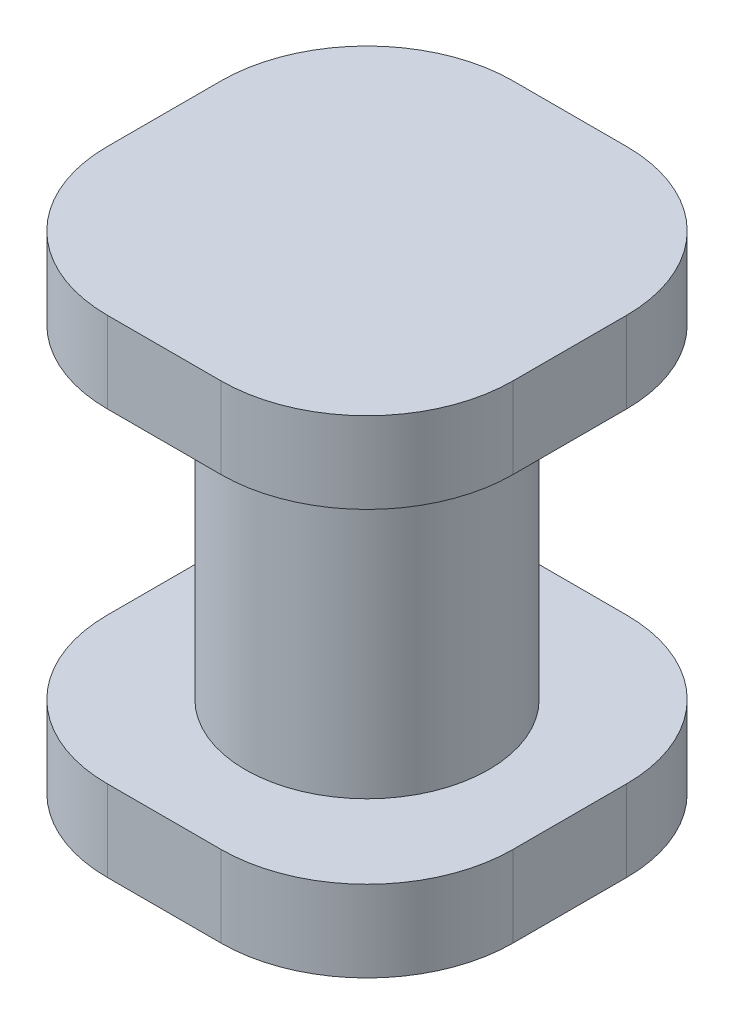
ISO-10303-21;
HEADER;
FILE_DESCRIPTION(('STEP AP214'),'2;1');
FILE_NAME('part.step','',(''),(''),'','','');
FILE_SCHEMA(('AUTOMOTIVE_DESIGN { 1 0 10303 214 1 1 1 1 }'));
ENDSEC;
DATA;
#1=APPLICATION_CONTEXT('core data for automotive mechanical design processes');
#2=APPLICATION_PROTOCOL_DEFINITION('international standard','automotive_design',2000,#1);
#3=PRODUCT_CONTEXT('',#1,'mechanical');
#4=PRODUCT('Part','Part','',(#3));
#5=PRODUCT_RELATED_PRODUCT_CATEGORY('part','',(#4));
#6=PRODUCT_DEFINITION_FORMATION('','',#4);
#7=PRODUCT_DEFINITION_CONTEXT('part definition',#1,'design');
#8=PRODUCT_DEFINITION('design','',#6,#7);
#9=PRODUCT_DEFINITION_SHAPE('','',#8);
#10=(LENGTH_UNIT() NAMED_UNIT(*) SI_UNIT(.MILLI.,.METRE.));
#11=(NAMED_UNIT(*) PLANE_ANGLE_UNIT() SI_UNIT($,.RADIAN.));
#12=(NAMED_UNIT(*) SI_UNIT($,.STERADIAN.) SOLID_ANGLE_UNIT());
#13=UNCERTAINTY_MEASURE_WITH_UNIT(LENGTH_MEASURE(1.E-05),#10,'distance_accuracy_value','');
#14=(GEOMETRIC_REPRESENTATION_CONTEXT(3) GLOBAL_UNCERTAINTY_ASSIGNED_CONTEXT((#13)) GLOBAL_UNIT_ASSIGNED_CONTEXT((#10,
#11,#12)) REPRESENTATION_CONTEXT('',''));
#15=CARTESIAN_POINT('',(0.,0.,0.));
#16=DIRECTION('',(0.,0.,1.));
#17=DIRECTION('',(1.,0.,0.));
#18=AXIS2_PLACEMENT_3D('',#15,#16,#17);
#19=CARTESIAN_POINT('',(0.,15.,0.));
#20=DIRECTION('',(0.,-1.,0.));
#21=DIRECTION('',(0.,0.,-1.));
#22=AXIS2_PLACEMENT_3D('',#19,#20,#21);
#23=CYLINDRICAL_SURFACE('',#22,3.75);
#24=CARTESIAN_POINT('',(0.,15.,0.));
#25=DIRECTION('',(0.,1.,0.));
#26=DIRECTION('',(0.,0.,1.));
#27=AXIS2_PLACEMENT_3D('',#24,#25,#26);
#28=CIRCLE('',#27,3.75);
#29=CARTESIAN_POINT('',(0.,15.,3.75));
#30=VERTEX_POINT('',#29);
#31=EDGE_CURVE('E11',#30,#30,#28,.T.);
#32=ORIENTED_EDGE('',*,*,#31,.F.);
#33=EDGE_LOOP('',(#32));
#34=FACE_BOUND('',#33,.T.);
#35=CARTESIAN_POINT('',(0.,5.,0.));
#36=DIRECTION('',(0.,1.,0.));
#37=DIRECTION('',(0.,0.,1.));
#38=AXIS2_PLACEMENT_3D('',#35,#36,#37);
#39=CIRCLE('',#38,3.75);
#40=CARTESIAN_POINT('',(0.,5.,3.75));
#41=VERTEX_POINT('',#40);
#42=EDGE_CURVE('E45',#41,#41,#39,.T.);
#43=ORIENTED_EDGE('',*,*,#42,.T.);
#44=EDGE_LOOP('',(#43));
#45=FACE_BOUND('',#44,.T.);
#46=ADVANCED_FACE('F42',(#34,#45),#23,.T.);
#47=CARTESIAN_POINT('',(-1.75,17.5,1.75));
#48=DIRECTION('',(0.,-1.,0.));
#49=DIRECTION('',(0.,0.,-1.));
#50=AXIS2_PLACEMENT_3D('',#47,#48,#49);
#51=CYLINDRICAL_SURFACE('',#50,4.5);
#52=CARTESIAN_POINT('',(-1.75,15.,1.75));
#53=DIRECTION('',(0.,1.,0.));
#54=DIRECTION('',(0.,0.,1.));
#55=AXIS2_PLACEMENT_3D('',#52,#53,#54);
#56=CIRCLE('',#55,4.5);
#57=CARTESIAN_POINT('',(-6.25,15.,1.74999999999997));
#58=VERTEX_POINT('',#57);
#59=CARTESIAN_POINT('',(-1.74999999999997,15.,6.25));
#60=VERTEX_POINT('',#59);
#61=EDGE_CURVE('E144',#58,#60,#56,.T.);
#62=ORIENTED_EDGE('',*,*,#61,.T.);
#63=DIRECTION('',(0.,-1.,0.));
#64=VECTOR('',#63,1.);
#65=CARTESIAN_POINT('',(-1.74999999999997,17.5,6.25));
#66=LINE('',#65,#64);
#67=CARTESIAN_POINT('',(-1.74999999999997,17.5,6.25));
#68=VERTEX_POINT('',#67);
#69=EDGE_CURVE('E51',#68,#60,#66,.T.);
#70=ORIENTED_EDGE('',*,*,#69,.F.);
#71=CARTESIAN_POINT('',(-1.75,17.5,1.75));
#72=DIRECTION('',(0.,1.,0.));
#73=DIRECTION('',(0.,0.,1.));
#74=AXIS2_PLACEMENT_3D('',#71,#72,#73);
#75=CIRCLE('',#74,4.5);
#76=CARTESIAN_POINT('',(-6.25,17.5,1.74999999999997));
#77=VERTEX_POINT('',#76);
#78=EDGE_CURVE('E158',#77,#68,#75,.T.);
#79=ORIENTED_EDGE('',*,*,#78,.F.);
#80=DIRECTION('',(0.,-1.,0.));
#81=VECTOR('',#80,1.);
#82=CARTESIAN_POINT('',(-6.25,17.5,1.74999999999997));
#83=LINE('',#82,#81);
#84=EDGE_CURVE('E140',#77,#58,#83,.T.);
#85=ORIENTED_EDGE('',*,*,#84,.T.);
#86=EDGE_LOOP('',(#62,#70,#79,#85));
#87=FACE_BOUND('',#86,.T.);
#88=ADVANCED_FACE('F176',(#87),#51,.T.);
#89=CARTESIAN_POINT('',(-1.74999999999997,17.5,6.25));
#90=DIRECTION('',(0.,0.,-1.));
#91=DIRECTION('',(-1.,0.,0.));
#92=AXIS2_PLACEMENT_3D('',#89,#90,#91);
#93=PLANE('',#92);
#94=DIRECTION('',(1.,0.,0.));
#95=VECTOR('',#94,1.);
#96=CARTESIAN_POINT('',(-1.74999999999997,15.,6.25));
#97=LINE('',#96,#95);
#98=CARTESIAN_POINT('',(1.74999999999997,15.,6.25));
#99=VERTEX_POINT('',#98);
#100=EDGE_CURVE('E147',#60,#99,#97,.T.);
#101=ORIENTED_EDGE('',*,*,#100,.T.);
#102=DIRECTION('',(0.,-1.,0.));
#103=VECTOR('',#102,1.);
#104=CARTESIAN_POINT('',(1.74999999999997,17.5,6.25));
#105=LINE('',#104,#103);
#106=CARTESIAN_POINT('',(1.74999999999997,17.5,6.25));
#107=VERTEX_POINT('',#106);
#108=EDGE_CURVE('E168',#107,#99,#105,.T.);
#109=ORIENTED_EDGE('',*,*,#108,.F.);
#110=DIRECTION('',(1.,0.,0.));
#111=VECTOR('',#110,1.);
#112=CARTESIAN_POINT('',(-1.74999999999997,17.5,6.25));
#113=LINE('',#112,#111);
#114=EDGE_CURVE('E104',#68,#107,#113,.T.);
#115=ORIENTED_EDGE('',*,*,#114,.F.);
#116=ORIENTED_EDGE('',*,*,#69,.T.);
#117=EDGE_LOOP('',(#101,#109,#115,#116));
#118=FACE_BOUND('',#117,.T.);
#119=ADVANCED_FACE('F172',(#118),#93,.F.);
#120=CARTESIAN_POINT('',(1.75,17.5,1.75));
#121=DIRECTION('',(0.,-1.,0.));
#122=DIRECTION('',(0.,0.,-1.));
#123=AXIS2_PLACEMENT_3D('',#120,#121,#122);
#124=CYLINDRICAL_SURFACE('',#123,4.5);
#125=CARTESIAN_POINT('',(1.75,15.,1.75));
#126=DIRECTION('',(0.,1.,0.));
#127=DIRECTION('',(0.,0.,1.));
#128=AXIS2_PLACEMENT_3D('',#125,#126,#127);
#129=CIRCLE('',#128,4.5);
#130=CARTESIAN_POINT('',(6.25,15.,1.74999999999997));
#131=VERTEX_POINT('',#130);
#132=EDGE_CURVE('E149',#99,#131,#129,.T.);
#133=ORIENTED_EDGE('',*,*,#132,.T.);
#134=DIRECTION('',(0.,-1.,0.));
#135=VECTOR('',#134,1.);
#136=CARTESIAN_POINT('',(6.25,17.5,1.74999999999997));
#137=LINE('',#136,#135);
#138=CARTESIAN_POINT('',(6.25,17.5,1.74999999999997));
#139=VERTEX_POINT('',#138);
#140=EDGE_CURVE('E165',#139,#131,#137,.T.);
#141=ORIENTED_EDGE('',*,*,#140,.F.);
#142=CARTESIAN_POINT('',(1.75,17.5,1.75));
#143=DIRECTION('',(0.,1.,0.));
#144=DIRECTION('',(0.,0.,1.));
#145=AXIS2_PLACEMENT_3D('',#142,#143,#144);
#146=CIRCLE('',#145,4.5);
#147=EDGE_CURVE('E191',#107,#139,#146,.T.);
#148=ORIENTED_EDGE('',*,*,#147,.F.);
#149=ORIENTED_EDGE('',*,*,#108,.T.);
#150=EDGE_LOOP('',(#133,#141,#148,#149));
#151=FACE_BOUND('',#150,.T.);
#152=ADVANCED_FACE('F184',(#151),#124,.T.);
#153=CARTESIAN_POINT('',(6.25,17.5,1.74999999999997));
#154=DIRECTION('',(-1.,0.,0.));
#155=DIRECTION('',(0.,0.,1.));
#156=AXIS2_PLACEMENT_3D('',#153,#154,#155);
#157=PLANE('',#156);
#158=DIRECTION('',(0.,0.,-1.));
#159=VECTOR('',#158,1.);
#160=CARTESIAN_POINT('',(6.25,15.,1.74999999999997));
#161=LINE('',#160,#159);
#162=CARTESIAN_POINT('',(6.25,15.,-1.74999999999997));
#163=VERTEX_POINT('',#162);
#164=EDGE_CURVE('E151',#131,#163,#161,.T.);
#165=ORIENTED_EDGE('',*,*,#164,.T.);
#166=DIRECTION('',(0.,-1.,0.));
#167=VECTOR('',#166,1.);
#168=CARTESIAN_POINT('',(6.25,17.5,-1.74999999999997));
#169=LINE('',#168,#167);
#170=CARTESIAN_POINT('',(6.25,17.5,-1.74999999999997));
#171=VERTEX_POINT('',#170);
#172=EDGE_CURVE('E162',#171,#163,#169,.T.);
#173=ORIENTED_EDGE('',*,*,#172,.F.);
#174=DIRECTION('',(0.,0.,-1.));
#175=VECTOR('',#174,1.);
#176=CARTESIAN_POINT('',(6.25,17.5,1.74999999999997));
#177=LINE('',#176,#175);
#178=EDGE_CURVE('E190',#139,#171,#177,.T.);
#179=ORIENTED_EDGE('',*,*,#178,.F.);
#180=ORIENTED_EDGE('',*,*,#140,.T.);
#181=EDGE_LOOP('',(#165,#173,#179,#180));
#182=FACE_BOUND('',#181,.T.);
#183=ADVANCED_FACE('F188',(#182),#157,.F.);
#184=CARTESIAN_POINT('',(1.75,17.5,-1.75));
#185=DIRECTION('',(0.,-1.,0.));
#186=DIRECTION('',(0.,0.,-1.));
#187=AXIS2_PLACEMENT_3D('',#184,#185,#186);
#188=CYLINDRICAL_SURFACE('',#187,4.5);
#189=CARTESIAN_POINT('',(1.75,15.,-1.75));
#190=DIRECTION('',(0.,1.,0.));
#191=DIRECTION('',(0.,0.,1.));
#192=AXIS2_PLACEMENT_3D('',#189,#190,#191);
#193=CIRCLE('',#192,4.5);
#194=CARTESIAN_POINT('',(1.74999999999997,15.,-6.25));
#195=VERTEX_POINT('',#194);
#196=EDGE_CURVE('E153',#163,#195,#193,.T.);
#197=ORIENTED_EDGE('',*,*,#196,.T.);
#198=DIRECTION('',(0.,-1.,0.));
#199=VECTOR('',#198,1.);
#200=CARTESIAN_POINT('',(1.74999999999997,17.5,-6.25));
#201=LINE('',#200,#199);
#202=CARTESIAN_POINT('',(1.74999999999997,17.5,-6.25));
#203=VERTEX_POINT('',#202);
#204=EDGE_CURVE('E135',#203,#195,#201,.T.);
#205=ORIENTED_EDGE('',*,*,#204,.F.);
#206=CARTESIAN_POINT('',(1.75,17.5,-1.75));
#207=DIRECTION('',(0.,1.,0.));
#208=DIRECTION('',(0.,0.,1.));
#209=AXIS2_PLACEMENT_3D('',#206,#207,#208);
#210=CIRCLE('',#209,4.5);
#211=EDGE_CURVE('E126',#171,#203,#210,.T.);
#212=ORIENTED_EDGE('',*,*,#211,.F.);
#213=ORIENTED_EDGE('',*,*,#172,.T.);
#214=EDGE_LOOP('',(#197,#205,#212,#213));
#215=FACE_BOUND('',#214,.T.);
#216=ADVANCED_FACE('F343',(#215),#188,.T.);
#217=CARTESIAN_POINT('',(-1.74999999999997,17.5,-6.25));
#218=DIRECTION('',(0.,0.,1.));
#219=DIRECTION('',(1.,0.,0.));
#220=AXIS2_PLACEMENT_3D('',#217,#218,#219);
#221=PLANE('',#220);
#222=DIRECTION('',(-1.,0.,0.));
#223=VECTOR('',#222,1.);
#224=CARTESIAN_POINT('',(-1.74999999999997,15.,-6.25));
#225=LINE('',#224,#223);
#226=CARTESIAN_POINT('',(-1.75,15.,-6.25));
#227=VERTEX_POINT('',#226);
#228=EDGE_CURVE('E134',#195,#227,#225,.T.);
#229=ORIENTED_EDGE('',*,*,#228,.T.);
#230=DIRECTION('',(0.,-1.,0.));
#231=VECTOR('',#230,1.);
#232=CARTESIAN_POINT('',(-1.75,17.5,-6.25));
#233=LINE('',#232,#231);
#234=CARTESIAN_POINT('',(-1.75,17.5,-6.25));
#235=VERTEX_POINT('',#234);
#236=EDGE_CURVE('E131',#235,#227,#233,.T.);
#237=ORIENTED_EDGE('',*,*,#236,.F.);
#238=DIRECTION('',(-1.,0.,0.));
#239=VECTOR('',#238,1.);
#240=CARTESIAN_POINT('',(-1.74999999999997,17.5,-6.25));
#241=LINE('',#240,#239);
#242=EDGE_CURVE('E120',#203,#235,#241,.T.);
#243=ORIENTED_EDGE('',*,*,#242,.F.);
#244=ORIENTED_EDGE('',*,*,#204,.T.);
#245=EDGE_LOOP('',(#229,#237,#243,#244));
#246=FACE_BOUND('',#245,.T.);
#247=ADVANCED_FACE('F132',(#246),#221,.F.);
#248=CARTESIAN_POINT('',(-1.75,17.5,-1.75));
#249=DIRECTION('',(0.,-1.,0.));
#250=DIRECTION('',(0.,0.,-1.));
#251=AXIS2_PLACEMENT_3D('',#248,#249,#250);
#252=CYLINDRICAL_SURFACE('',#251,4.5);
#253=CARTESIAN_POINT('',(-1.75,15.,-1.75));
#254=DIRECTION('',(0.,1.,0.));
#255=DIRECTION('',(0.,0.,-1.));
#256=AXIS2_PLACEMENT_3D('',#253,#254,#255);
#257=CIRCLE('',#256,4.5);
#258=CARTESIAN_POINT('',(-6.25,15.,-1.74999999999997));
#259=VERTEX_POINT('',#258);
#260=EDGE_CURVE('E89',#227,#259,#257,.T.);
#261=ORIENTED_EDGE('',*,*,#260,.T.);
#262=DIRECTION('',(0.,-1.,0.));
#263=VECTOR('',#262,1.);
#264=CARTESIAN_POINT('',(-6.25,17.5,-1.74999999999997));
#265=LINE('',#264,#263);
#266=CARTESIAN_POINT('',(-6.25,17.5,-1.74999999999997));
#267=VERTEX_POINT('',#266);
#268=EDGE_CURVE('E136',#267,#259,#265,.T.);
#269=ORIENTED_EDGE('',*,*,#268,.F.);
#270=CARTESIAN_POINT('',(-1.75,17.5,-1.75));
#271=DIRECTION('',(0.,1.,0.));
#272=DIRECTION('',(0.,0.,-1.));
#273=AXIS2_PLACEMENT_3D('',#270,#271,#272);
#274=CIRCLE('',#273,4.5);
#275=EDGE_CURVE('E124',#235,#267,#274,.T.);
#276=ORIENTED_EDGE('',*,*,#275,.F.);
#277=ORIENTED_EDGE('',*,*,#236,.T.);
#278=EDGE_LOOP('',(#261,#269,#276,#277));
#279=FACE_BOUND('',#278,.T.);
#280=ADVANCED_FACE('F138',(#279),#252,.T.);
#281=CARTESIAN_POINT('',(-6.25,17.5,1.74999999999997));
#282=DIRECTION('',(1.,0.,0.));
#283=DIRECTION('',(0.,0.,-1.));
#284=AXIS2_PLACEMENT_3D('',#281,#282,#283);
#285=PLANE('',#284);
#286=DIRECTION('',(0.,0.,1.));
#287=VECTOR('',#286,1.);
#288=CARTESIAN_POINT('',(-6.25,15.,1.74999999999997));
#289=LINE('',#288,#287);
#290=EDGE_CURVE('E95',#259,#58,#289,.T.);
#291=ORIENTED_EDGE('',*,*,#290,.T.);
#292=ORIENTED_EDGE('',*,*,#84,.F.);
#293=DIRECTION('',(0.,0.,1.));
#294=VECTOR('',#293,1.);
#295=CARTESIAN_POINT('',(-6.25,17.5,1.74999999999997));
#296=LINE('',#295,#294);
#297=EDGE_CURVE('E59',#267,#77,#296,.T.);
#298=ORIENTED_EDGE('',*,*,#297,.F.);
#299=ORIENTED_EDGE('',*,*,#268,.T.);
#300=EDGE_LOOP('',(#291,#292,#298,#299));
#301=FACE_BOUND('',#300,.T.);
#302=ADVANCED_FACE('F334',(#301),#285,.F.);
#303=CARTESIAN_POINT('',(-1.75,17.5,1.75));
#304=DIRECTION('',(0.,1.,0.));
#305=DIRECTION('',(0.,0.,1.));
#306=AXIS2_PLACEMENT_3D('',#303,#304,#305);
#307=PLANE('',#306);
#308=ORIENTED_EDGE('',*,*,#78,.T.);
#309=ORIENTED_EDGE('',*,*,#114,.T.);
#310=ORIENTED_EDGE('',*,*,#147,.T.);
#311=ORIENTED_EDGE('',*,*,#178,.T.);
#312=ORIENTED_EDGE('',*,*,#211,.T.);
#313=ORIENTED_EDGE('',*,*,#242,.T.);
#314=ORIENTED_EDGE('',*,*,#275,.T.);
#315=ORIENTED_EDGE('',*,*,#297,.T.);
#316=EDGE_LOOP('',(#308,#309,#310,#311,#312,#313,#314,#315));
#317=FACE_BOUND('',#316,.T.);
#318=ADVANCED_FACE('F122',(#317),#307,.T.);
#319=CARTESIAN_POINT('',(-1.75,15.,1.75));
#320=DIRECTION('',(0.,1.,0.));
#321=DIRECTION('',(0.,0.,1.));
#322=AXIS2_PLACEMENT_3D('',#319,#320,#321);
#323=PLANE('',#322);
#324=ORIENTED_EDGE('',*,*,#31,.T.);
#325=EDGE_LOOP('',(#324));
#326=FACE_BOUND('',#325,.T.);
#327=ORIENTED_EDGE('',*,*,#61,.F.);
#328=ORIENTED_EDGE('',*,*,#290,.F.);
#329=ORIENTED_EDGE('',*,*,#260,.F.);
#330=ORIENTED_EDGE('',*,*,#228,.F.);
#331=ORIENTED_EDGE('',*,*,#196,.F.);
#332=ORIENTED_EDGE('',*,*,#164,.F.);
#333=ORIENTED_EDGE('',*,*,#132,.F.);
#334=ORIENTED_EDGE('',*,*,#100,.F.);
#335=EDGE_LOOP('',(#327,#328,#329,#330,#331,#332,#333,#334));
#336=FACE_BOUND('',#335,.T.);
#337=ADVANCED_FACE('F178',(#326,#336),#323,.F.);
#338=CARTESIAN_POINT('',(-1.75,2.5,-1.75));
#339=DIRECTION('',(0.,1.,0.));
#340=DIRECTION('',(0.,0.,1.));
#341=AXIS2_PLACEMENT_3D('',#338,#339,#340);
#342=CYLINDRICAL_SURFACE('',#341,4.5);
#343=CARTESIAN_POINT('',(-1.75,5.,-1.75));
#344=DIRECTION('',(0.,-1.,0.));
#345=DIRECTION('',(0.,0.,-1.));
#346=AXIS2_PLACEMENT_3D('',#343,#344,#345);
#347=CIRCLE('',#346,4.5);
#348=CARTESIAN_POINT('',(-6.25,5.,-1.74999999999997));
#349=VERTEX_POINT('',#348);
#350=CARTESIAN_POINT('',(-1.74999999999997,5.,-6.25));
#351=VERTEX_POINT('',#350);
#352=EDGE_CURVE('E244',#349,#351,#347,.T.);
#353=ORIENTED_EDGE('',*,*,#352,.T.);
#354=DIRECTION('',(0.,1.,0.));
#355=VECTOR('',#354,1.);
#356=CARTESIAN_POINT('',(-1.74999999999997,2.5,-6.25));
#357=LINE('',#356,#355);
#358=CARTESIAN_POINT('',(-1.74999999999997,2.5,-6.25));
#359=VERTEX_POINT('',#358);
#360=EDGE_CURVE('E197',#359,#351,#357,.T.);
#361=ORIENTED_EDGE('',*,*,#360,.F.);
#362=CARTESIAN_POINT('',(-1.75,2.5,-1.75));
#363=DIRECTION('',(0.,-1.,0.));
#364=DIRECTION('',(0.,0.,-1.));
#365=AXIS2_PLACEMENT_3D('',#362,#363,#364);
#366=CIRCLE('',#365,4.5);
#367=CARTESIAN_POINT('',(-6.25,2.5,-1.74999999999997));
#368=VERTEX_POINT('',#367);
#369=EDGE_CURVE('E225',#368,#359,#366,.T.);
#370=ORIENTED_EDGE('',*,*,#369,.F.);
#371=DIRECTION('',(0.,1.,0.));
#372=VECTOR('',#371,1.);
#373=CARTESIAN_POINT('',(-6.25,2.5,-1.74999999999997));
#374=LINE('',#373,#372);
#375=EDGE_CURVE('E218',#368,#349,#374,.T.);
#376=ORIENTED_EDGE('',*,*,#375,.T.);
#377=EDGE_LOOP('',(#353,#361,#370,#376));
#378=FACE_BOUND('',#377,.T.);
#379=ADVANCED_FACE('F280',(#378),#342,.T.);
#380=CARTESIAN_POINT('',(-1.74999999999997,2.5,-6.25));
#381=DIRECTION('',(0.,0.,1.));
#382=DIRECTION('',(1.,0.,0.));
#383=AXIS2_PLACEMENT_3D('',#380,#381,#382);
#384=PLANE('',#383);
#385=DIRECTION('',(1.,0.,0.));
#386=VECTOR('',#385,1.);
#387=CARTESIAN_POINT('',(-1.74999999999997,5.,-6.25));
#388=LINE('',#387,#386);
#389=CARTESIAN_POINT('',(1.74999999999997,5.,-6.25));
#390=VERTEX_POINT('',#389);
#391=EDGE_CURVE('E241',#351,#390,#388,.T.);
#392=ORIENTED_EDGE('',*,*,#391,.T.);
#393=DIRECTION('',(0.,1.,0.));
#394=VECTOR('',#393,1.);
#395=CARTESIAN_POINT('',(1.74999999999997,2.5,-6.25));
#396=LINE('',#395,#394);
#397=CARTESIAN_POINT('',(1.74999999999997,2.5,-6.25));
#398=VERTEX_POINT('',#397);
#399=EDGE_CURVE('E200',#398,#390,#396,.T.);
#400=ORIENTED_EDGE('',*,*,#399,.F.);
#401=DIRECTION('',(1.,0.,0.));
#402=VECTOR('',#401,1.);
#403=CARTESIAN_POINT('',(-1.74999999999997,2.5,-6.25));
#404=LINE('',#403,#402);
#405=EDGE_CURVE('E264',#359,#398,#404,.T.);
#406=ORIENTED_EDGE('',*,*,#405,.F.);
#407=ORIENTED_EDGE('',*,*,#360,.T.);
#408=EDGE_LOOP('',(#392,#400,#406,#407));
#409=FACE_BOUND('',#408,.T.);
#410=ADVANCED_FACE('F284',(#409),#384,.F.);
#411=CARTESIAN_POINT('',(1.75,2.5,-1.75));
#412=DIRECTION('',(0.,1.,0.));
#413=DIRECTION('',(0.,0.,1.));
#414=AXIS2_PLACEMENT_3D('',#411,#412,#413);
#415=CYLINDRICAL_SURFACE('',#414,4.5);
#416=CARTESIAN_POINT('',(1.75,5.,-1.75));
#417=DIRECTION('',(0.,-1.,0.));
#418=DIRECTION('',(0.,0.,-1.));
#419=AXIS2_PLACEMENT_3D('',#416,#417,#418);
#420=CIRCLE('',#419,4.5);
#421=CARTESIAN_POINT('',(6.25,5.,-1.74999999999997));
#422=VERTEX_POINT('',#421);
#423=EDGE_CURVE('E238',#390,#422,#420,.T.);
#424=ORIENTED_EDGE('',*,*,#423,.T.);
#425=DIRECTION('',(0.,1.,0.));
#426=VECTOR('',#425,1.);
#427=CARTESIAN_POINT('',(6.25,2.5,-1.74999999999997));
#428=LINE('',#427,#426);
#429=CARTESIAN_POINT('',(6.25,2.5,-1.74999999999997));
#430=VERTEX_POINT('',#429);
#431=EDGE_CURVE('E203',#430,#422,#428,.T.);
#432=ORIENTED_EDGE('',*,*,#431,.F.);
#433=CARTESIAN_POINT('',(1.75,2.5,-1.75));
#434=DIRECTION('',(0.,-1.,0.));
#435=DIRECTION('',(0.,0.,-1.));
#436=AXIS2_PLACEMENT_3D('',#433,#434,#435);
#437=CIRCLE('',#436,4.5);
#438=EDGE_CURVE('E261',#398,#430,#437,.T.);
#439=ORIENTED_EDGE('',*,*,#438,.F.);
#440=ORIENTED_EDGE('',*,*,#399,.T.);
#441=EDGE_LOOP('',(#424,#432,#439,#440));
#442=FACE_BOUND('',#441,.T.);
#443=ADVANCED_FACE('F406',(#442),#415,.T.);
#444=CARTESIAN_POINT('',(6.25,2.5,1.74999999999997));
#445=DIRECTION('',(-1.,0.,0.));
#446=DIRECTION('',(0.,0.,1.));
#447=AXIS2_PLACEMENT_3D('',#444,#445,#446);
#448=PLANE('',#447);
#449=DIRECTION('',(0.,0.,1.));
#450=VECTOR('',#449,1.);
#451=CARTESIAN_POINT('',(6.25,5.,1.74999999999997));
#452=LINE('',#451,#450);
#453=CARTESIAN_POINT('',(6.25,5.,1.74999999999997));
#454=VERTEX_POINT('',#453);
#455=EDGE_CURVE('E235',#422,#454,#452,.T.);
#456=ORIENTED_EDGE('',*,*,#455,.T.);
#457=DIRECTION('',(0.,1.,0.));
#458=VECTOR('',#457,1.);
#459=CARTESIAN_POINT('',(6.25,2.5,1.74999999999997));
#460=LINE('',#459,#458);
#461=CARTESIAN_POINT('',(6.25,2.5,1.74999999999997));
#462=VERTEX_POINT('',#461);
#463=EDGE_CURVE('E206',#462,#454,#460,.T.);
#464=ORIENTED_EDGE('',*,*,#463,.F.);
#465=DIRECTION('',(0.,0.,1.));
#466=VECTOR('',#465,1.);
#467=CARTESIAN_POINT('',(6.25,2.5,1.74999999999997));
#468=LINE('',#467,#466);
#469=EDGE_CURVE('E258',#430,#462,#468,.T.);
#470=ORIENTED_EDGE('',*,*,#469,.F.);
#471=ORIENTED_EDGE('',*,*,#431,.T.);
#472=EDGE_LOOP('',(#456,#464,#470,#471));
#473=FACE_BOUND('',#472,.T.);
#474=ADVANCED_FACE('F416',(#473),#448,.F.);
#475=CARTESIAN_POINT('',(1.75,2.5,1.75));
#476=DIRECTION('',(0.,1.,0.));
#477=DIRECTION('',(0.,0.,1.));
#478=AXIS2_PLACEMENT_3D('',#475,#476,#477);
#479=CYLINDRICAL_SURFACE('',#478,4.5);
#480=CARTESIAN_POINT('',(1.75,5.,1.75));
#481=DIRECTION('',(0.,-1.,0.));
#482=DIRECTION('',(0.,0.,1.));
#483=AXIS2_PLACEMENT_3D('',#480,#481,#482);
#484=CIRCLE('',#483,4.5);
#485=CARTESIAN_POINT('',(1.74999999999997,5.,6.25));
#486=VERTEX_POINT('',#485);
#487=EDGE_CURVE('E232',#454,#486,#484,.T.);
#488=ORIENTED_EDGE('',*,*,#487,.T.);
#489=DIRECTION('',(0.,1.,0.));
#490=VECTOR('',#489,1.);
#491=CARTESIAN_POINT('',(1.74999999999997,2.5,6.25));
#492=LINE('',#491,#490);
#493=CARTESIAN_POINT('',(1.74999999999997,2.5,6.25));
#494=VERTEX_POINT('',#493);
#495=EDGE_CURVE('E209',#494,#486,#492,.T.);
#496=ORIENTED_EDGE('',*,*,#495,.F.);
#497=CARTESIAN_POINT('',(1.75,2.5,1.75));
#498=DIRECTION('',(0.,-1.,0.));
#499=DIRECTION('',(0.,0.,1.));
#500=AXIS2_PLACEMENT_3D('',#497,#498,#499);
#501=CIRCLE('',#500,4.5);
#502=EDGE_CURVE('E255',#462,#494,#501,.T.);
#503=ORIENTED_EDGE('',*,*,#502,.F.);
#504=ORIENTED_EDGE('',*,*,#463,.T.);
#505=EDGE_LOOP('',(#488,#496,#503,#504));
#506=FACE_BOUND('',#505,.T.);
#507=ADVANCED_FACE('F427',(#506),#479,.T.);
#508=CARTESIAN_POINT('',(-1.74999999999997,2.5,6.25));
#509=DIRECTION('',(0.,0.,-1.));
#510=DIRECTION('',(-1.,0.,0.));
#511=AXIS2_PLACEMENT_3D('',#508,#509,#510);
#512=PLANE('',#511);
#513=DIRECTION('',(-1.,0.,0.));
#514=VECTOR('',#513,1.);
#515=CARTESIAN_POINT('',(-1.74999999999997,5.,6.25));
#516=LINE('',#515,#514);
#517=CARTESIAN_POINT('',(-1.74999999999997,5.,6.25));
#518=VERTEX_POINT('',#517);
#519=EDGE_CURVE('E229',#486,#518,#516,.T.);
#520=ORIENTED_EDGE('',*,*,#519,.T.);
#521=DIRECTION('',(0.,1.,0.));
#522=VECTOR('',#521,1.);
#523=CARTESIAN_POINT('',(-1.74999999999997,2.5,6.25));
#524=LINE('',#523,#522);
#525=CARTESIAN_POINT('',(-1.74999999999997,2.5,6.25));
#526=VERTEX_POINT('',#525);
#527=EDGE_CURVE('E212',#526,#518,#524,.T.);
#528=ORIENTED_EDGE('',*,*,#527,.F.);
#529=DIRECTION('',(-1.,0.,0.));
#530=VECTOR('',#529,1.);
#531=CARTESIAN_POINT('',(-1.74999999999997,2.5,6.25));
#532=LINE('',#531,#530);
#533=EDGE_CURVE('E252',#494,#526,#532,.T.);
#534=ORIENTED_EDGE('',*,*,#533,.F.);
#535=ORIENTED_EDGE('',*,*,#495,.T.);
#536=EDGE_LOOP('',(#520,#528,#534,#535));
#537=FACE_BOUND('',#536,.T.);
#538=ADVANCED_FACE('F438',(#537),#512,.F.);
#539=CARTESIAN_POINT('',(-1.75,2.5,1.75));
#540=DIRECTION('',(0.,1.,0.));
#541=DIRECTION('',(0.,0.,1.));
#542=AXIS2_PLACEMENT_3D('',#539,#540,#541);
#543=CYLINDRICAL_SURFACE('',#542,4.5);
#544=CARTESIAN_POINT('',(-1.75,5.,1.75));
#545=DIRECTION('',(0.,-1.,0.));
#546=DIRECTION('',(0.,0.,-1.));
#547=AXIS2_PLACEMENT_3D('',#544,#545,#546);
#548=CIRCLE('',#547,4.5);
#549=CARTESIAN_POINT('',(-6.25,5.,1.74999999999997));
#550=VERTEX_POINT('',#549);
#551=EDGE_CURVE('E226',#518,#550,#548,.T.);
#552=ORIENTED_EDGE('',*,*,#551,.T.);
#553=DIRECTION('',(0.,1.,0.));
#554=VECTOR('',#553,1.);
#555=CARTESIAN_POINT('',(-6.25,2.5,1.74999999999997));
#556=LINE('',#555,#554);
#557=CARTESIAN_POINT('',(-6.25,2.5,1.74999999999997));
#558=VERTEX_POINT('',#557);
#559=EDGE_CURVE('E215',#558,#550,#556,.T.);
#560=ORIENTED_EDGE('',*,*,#559,.F.);
#561=CARTESIAN_POINT('',(-1.75,2.5,1.75));
#562=DIRECTION('',(0.,-1.,0.));
#563=DIRECTION('',(0.,0.,-1.));
#564=AXIS2_PLACEMENT_3D('',#561,#562,#563);
#565=CIRCLE('',#564,4.5);
#566=EDGE_CURVE('E249',#526,#558,#565,.T.);
#567=ORIENTED_EDGE('',*,*,#566,.F.);
#568=ORIENTED_EDGE('',*,*,#527,.T.);
#569=EDGE_LOOP('',(#552,#560,#567,#568));
#570=FACE_BOUND('',#569,.T.);
#571=ADVANCED_FACE('F449',(#570),#543,.T.);
#572=CARTESIAN_POINT('',(-6.25,2.5,1.74999999999997));
#573=DIRECTION('',(1.,0.,0.));
#574=DIRECTION('',(0.,0.,-1.));
#575=AXIS2_PLACEMENT_3D('',#572,#573,#574);
#576=PLANE('',#575);
#577=DIRECTION('',(0.,0.,-1.));
#578=VECTOR('',#577,1.);
#579=CARTESIAN_POINT('',(-6.25,5.,1.74999999999997));
#580=LINE('',#579,#578);
#581=EDGE_CURVE('E222',#550,#349,#580,.T.);
#582=ORIENTED_EDGE('',*,*,#581,.T.);
#583=ORIENTED_EDGE('',*,*,#375,.F.);
#584=DIRECTION('',(0.,0.,-1.));
#585=VECTOR('',#584,1.);
#586=CARTESIAN_POINT('',(-6.25,2.5,1.74999999999997));
#587=LINE('',#586,#585);
#588=EDGE_CURVE('E221',#558,#368,#587,.T.);
#589=ORIENTED_EDGE('',*,*,#588,.F.);
#590=ORIENTED_EDGE('',*,*,#559,.T.);
#591=EDGE_LOOP('',(#582,#583,#589,#590));
#592=FACE_BOUND('',#591,.T.);
#593=ADVANCED_FACE('F307',(#592),#576,.F.);
#594=CARTESIAN_POINT('',(-1.75,2.5,-1.75));
#595=DIRECTION('',(0.,-1.,0.));
#596=DIRECTION('',(0.,0.,-1.));
#597=AXIS2_PLACEMENT_3D('',#594,#595,#596);
#598=PLANE('',#597);
#599=ORIENTED_EDGE('',*,*,#369,.T.);
#600=ORIENTED_EDGE('',*,*,#405,.T.);
#601=ORIENTED_EDGE('',*,*,#438,.T.);
#602=ORIENTED_EDGE('',*,*,#469,.T.);
#603=ORIENTED_EDGE('',*,*,#502,.T.);
#604=ORIENTED_EDGE('',*,*,#533,.T.);
#605=ORIENTED_EDGE('',*,*,#566,.T.);
#606=ORIENTED_EDGE('',*,*,#588,.T.);
#607=EDGE_LOOP('',(#599,#600,#601,#602,#603,#604,#605,#606));
#608=FACE_BOUND('',#607,.T.);
#609=ADVANCED_FACE('F272',(#608),#598,.T.);
#610=CARTESIAN_POINT('',(-1.75,5.,-1.75));
#611=DIRECTION('',(0.,-1.,0.));
#612=DIRECTION('',(0.,0.,-1.));
#613=AXIS2_PLACEMENT_3D('',#610,#611,#612);
#614=PLANE('',#613);
#615=ORIENTED_EDGE('',*,*,#42,.F.);
#616=EDGE_LOOP('',(#615));
#617=FACE_BOUND('',#616,.T.);
#618=ORIENTED_EDGE('',*,*,#352,.F.);
#619=ORIENTED_EDGE('',*,*,#581,.F.);
#620=ORIENTED_EDGE('',*,*,#551,.F.);
#621=ORIENTED_EDGE('',*,*,#519,.F.);
#622=ORIENTED_EDGE('',*,*,#487,.F.);
#623=ORIENTED_EDGE('',*,*,#455,.F.);
#624=ORIENTED_EDGE('',*,*,#423,.F.);
#625=ORIENTED_EDGE('',*,*,#391,.F.);
#626=EDGE_LOOP('',(#618,#619,#620,#621,#622,#623,#624,#625));
#627=FACE_BOUND('',#626,.T.);
#628=ADVANCED_FACE('F308',(#617,#627),#614,.F.);
#629=CLOSED_SHELL('',(#46,#88,#119,#152,#183,#216,#247,#280,#302,#318,#337,#379,#410,#443,#474,
#507,#538,#571,#593,#609,#628));
#630=MANIFOLD_SOLID_BREP('B2',#629);
#631=ADVANCED_BREP_SHAPE_REPRESENTATION('',(#18,#630),#14);
#632=SHAPE_DEFINITION_REPRESENTATION(#9,#631);
ENDSEC;
END-ISO-10303-21;
